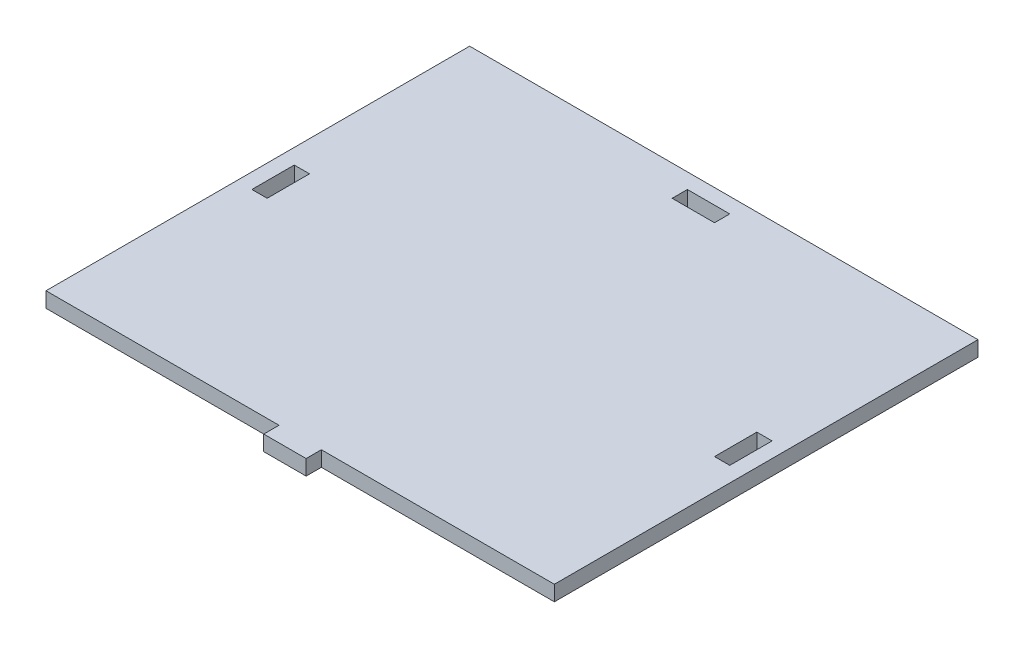
ISO-10303-21;
HEADER;
FILE_DESCRIPTION(('STEP AP214'),'2;1');
FILE_NAME('part.step','',(''),(''),'','','');
FILE_SCHEMA(('AUTOMOTIVE_DESIGN { 1 0 10303 214 1 1 1 1 }'));
ENDSEC;
DATA;
#1=APPLICATION_CONTEXT('core data for automotive mechanical design processes');
#2=APPLICATION_PROTOCOL_DEFINITION('international standard','automotive_design',2000,#1);
#3=PRODUCT_CONTEXT('',#1,'mechanical');
#4=PRODUCT('Part','Part','',(#3));
#5=PRODUCT_RELATED_PRODUCT_CATEGORY('part','',(#4));
#6=PRODUCT_DEFINITION_FORMATION('','',#4);
#7=PRODUCT_DEFINITION_CONTEXT('part definition',#1,'design');
#8=PRODUCT_DEFINITION('design','',#6,#7);
#9=PRODUCT_DEFINITION_SHAPE('','',#8);
#10=(LENGTH_UNIT() NAMED_UNIT(*) SI_UNIT(.MILLI.,.METRE.));
#11=(NAMED_UNIT(*) PLANE_ANGLE_UNIT() SI_UNIT($,.RADIAN.));
#12=(NAMED_UNIT(*) SI_UNIT($,.STERADIAN.) SOLID_ANGLE_UNIT());
#13=UNCERTAINTY_MEASURE_WITH_UNIT(LENGTH_MEASURE(1.E-05),#10,'distance_accuracy_value','');
#14=(GEOMETRIC_REPRESENTATION_CONTEXT(3) GLOBAL_UNCERTAINTY_ASSIGNED_CONTEXT((#13)) GLOBAL_UNIT_ASSIGNED_CONTEXT((#10,
#11,#12)) REPRESENTATION_CONTEXT('',''));
#15=CARTESIAN_POINT('',(0.,0.,0.));
#16=DIRECTION('',(0.,0.,1.));
#17=DIRECTION('',(1.,0.,0.));
#18=AXIS2_PLACEMENT_3D('',#15,#16,#17);
#19=CARTESIAN_POINT('',(0.,18.,0.));
#20=DIRECTION('',(0.,-1.,0.));
#21=DIRECTION('',(0.,0.,-1.));
#22=AXIS2_PLACEMENT_3D('',#19,#20,#21);
#23=PLANE('',#22);
#24=DIRECTION('',(0.,0.,-1.));
#25=VECTOR('',#24,1.);
#26=CARTESIAN_POINT('',(282.,18.,-25.));
#27=LINE('',#26,#25);
#28=CARTESIAN_POINT('',(282.,18.,25.));
#29=VERTEX_POINT('',#28);
#30=CARTESIAN_POINT('',(282.,18.,-25.));
#31=VERTEX_POINT('',#30);
#32=EDGE_CURVE('E206',#29,#31,#27,.T.);
#33=ORIENTED_EDGE('',*,*,#32,.F.);
#34=DIRECTION('',(1.,0.,0.));
#35=VECTOR('',#34,1.);
#36=CARTESIAN_POINT('',(264.,18.,25.));
#37=LINE('',#36,#35);
#38=CARTESIAN_POINT('',(264.,18.,25.));
#39=VERTEX_POINT('',#38);
#40=EDGE_CURVE('E214',#39,#29,#37,.T.);
#41=ORIENTED_EDGE('',*,*,#40,.F.);
#42=DIRECTION('',(0.,0.,1.));
#43=VECTOR('',#42,1.);
#44=CARTESIAN_POINT('',(264.,18.,-25.));
#45=LINE('',#44,#43);
#46=CARTESIAN_POINT('',(264.,18.,-25.));
#47=VERTEX_POINT('',#46);
#48=EDGE_CURVE('E211',#47,#39,#45,.T.);
#49=ORIENTED_EDGE('',*,*,#48,.F.);
#50=DIRECTION('',(-1.,0.,0.));
#51=VECTOR('',#50,1.);
#52=CARTESIAN_POINT('',(264.,18.,-25.));
#53=LINE('',#52,#51);
#54=EDGE_CURVE('E208',#31,#47,#53,.T.);
#55=ORIENTED_EDGE('',*,*,#54,.F.);
#56=EDGE_LOOP('',(#33,#41,#49,#55));
#57=FACE_BOUND('',#56,.T.);
#58=DIRECTION('',(1.,0.,0.));
#59=VECTOR('',#58,1.);
#60=CARTESIAN_POINT('',(24.9999999999999,18.,250.));
#61=LINE('',#60,#59);
#62=CARTESIAN_POINT('',(24.9999999999999,18.,250.));
#63=VERTEX_POINT('',#62);
#64=CARTESIAN_POINT('',(300.,18.,250.));
#65=VERTEX_POINT('',#64);
#66=EDGE_CURVE('E268',#63,#65,#61,.T.);
#67=ORIENTED_EDGE('',*,*,#66,.T.);
#68=DIRECTION('',(0.,0.,-1.));
#69=VECTOR('',#68,1.);
#70=CARTESIAN_POINT('',(300.,18.,-250.));
#71=LINE('',#70,#69);
#72=CARTESIAN_POINT('',(300.,18.,-250.));
#73=VERTEX_POINT('',#72);
#74=EDGE_CURVE('E271',#65,#73,#71,.T.);
#75=ORIENTED_EDGE('',*,*,#74,.T.);
#76=DIRECTION('',(-1.,0.,0.));
#77=VECTOR('',#76,1.);
#78=CARTESIAN_POINT('',(-300.,18.,-250.));
#79=LINE('',#78,#77);
#80=CARTESIAN_POINT('',(-300.,18.,-250.));
#81=VERTEX_POINT('',#80);
#82=EDGE_CURVE('E274',#73,#81,#79,.T.);
#83=ORIENTED_EDGE('',*,*,#82,.T.);
#84=DIRECTION('',(0.,0.,1.));
#85=VECTOR('',#84,1.);
#86=CARTESIAN_POINT('',(-300.,18.,-250.));
#87=LINE('',#86,#85);
#88=CARTESIAN_POINT('',(-300.,18.,250.));
#89=VERTEX_POINT('',#88);
#90=EDGE_CURVE('E276',#81,#89,#87,.T.);
#91=ORIENTED_EDGE('',*,*,#90,.T.);
#92=DIRECTION('',(1.,0.,0.));
#93=VECTOR('',#92,1.);
#94=CARTESIAN_POINT('',(-300.,18.,250.));
#95=LINE('',#94,#93);
#96=CARTESIAN_POINT('',(-25.0000000000001,18.,250.));
#97=VERTEX_POINT('',#96);
#98=EDGE_CURVE('E278',#89,#97,#95,.T.);
#99=ORIENTED_EDGE('',*,*,#98,.T.);
#100=DIRECTION('',(0.,0.,1.));
#101=VECTOR('',#100,1.);
#102=CARTESIAN_POINT('',(-25.0000000000001,18.,250.));
#103=LINE('',#102,#101);
#104=CARTESIAN_POINT('',(-25.0000000000001,18.,268.));
#105=VERTEX_POINT('',#104);
#106=EDGE_CURVE('E280',#97,#105,#103,.T.);
#107=ORIENTED_EDGE('',*,*,#106,.T.);
#108=DIRECTION('',(1.,0.,0.));
#109=VECTOR('',#108,1.);
#110=CARTESIAN_POINT('',(-25.0000000000001,18.,268.));
#111=LINE('',#110,#109);
#112=CARTESIAN_POINT('',(24.9999999999999,18.,268.));
#113=VERTEX_POINT('',#112);
#114=EDGE_CURVE('E282',#105,#113,#111,.T.);
#115=ORIENTED_EDGE('',*,*,#114,.T.);
#116=DIRECTION('',(0.,0.,-1.));
#117=VECTOR('',#116,1.);
#118=CARTESIAN_POINT('',(24.9999999999999,18.,250.));
#119=LINE('',#118,#117);
#120=EDGE_CURVE('E284',#113,#63,#119,.T.);
#121=ORIENTED_EDGE('',*,*,#120,.T.);
#122=EDGE_LOOP('',(#67,#75,#83,#91,#99,#107,#115,#121));
#123=FACE_BOUND('',#122,.T.);
#124=DIRECTION('',(0.,0.,-1.));
#125=VECTOR('',#124,1.);
#126=CARTESIAN_POINT('',(25.,18.,-232.));
#127=LINE('',#126,#125);
#128=CARTESIAN_POINT('',(25.,18.,-214.));
#129=VERTEX_POINT('',#128);
#130=CARTESIAN_POINT('',(25.,18.,-232.));
#131=VERTEX_POINT('',#130);
#132=EDGE_CURVE('E237',#129,#131,#127,.T.);
#133=ORIENTED_EDGE('',*,*,#132,.F.);
#134=DIRECTION('',(1.,0.,0.));
#135=VECTOR('',#134,1.);
#136=CARTESIAN_POINT('',(-25.,18.,-214.));
#137=LINE('',#136,#135);
#138=CARTESIAN_POINT('',(-25.,18.,-214.));
#139=VERTEX_POINT('',#138);
#140=EDGE_CURVE('E245',#139,#129,#137,.T.);
#141=ORIENTED_EDGE('',*,*,#140,.F.);
#142=DIRECTION('',(0.,0.,1.));
#143=VECTOR('',#142,1.);
#144=CARTESIAN_POINT('',(-25.,18.,-232.));
#145=LINE('',#144,#143);
#146=CARTESIAN_POINT('',(-25.,18.,-232.));
#147=VERTEX_POINT('',#146);
#148=EDGE_CURVE('E242',#147,#139,#145,.T.);
#149=ORIENTED_EDGE('',*,*,#148,.F.);
#150=DIRECTION('',(-1.,0.,0.));
#151=VECTOR('',#150,1.);
#152=CARTESIAN_POINT('',(-25.,18.,-232.));
#153=LINE('',#152,#151);
#154=EDGE_CURVE('E239',#131,#147,#153,.T.);
#155=ORIENTED_EDGE('',*,*,#154,.F.);
#156=EDGE_LOOP('',(#133,#141,#149,#155));
#157=FACE_BOUND('',#156,.T.);
#158=DIRECTION('',(0.,0.,-1.));
#159=VECTOR('',#158,1.);
#160=CARTESIAN_POINT('',(-264.,18.,-25.));
#161=LINE('',#160,#159);
#162=CARTESIAN_POINT('',(-264.,18.,25.));
#163=VERTEX_POINT('',#162);
#164=CARTESIAN_POINT('',(-264.,18.,-25.));
#165=VERTEX_POINT('',#164);
#166=EDGE_CURVE('E170',#163,#165,#161,.T.);
#167=ORIENTED_EDGE('',*,*,#166,.F.);
#168=DIRECTION('',(1.,0.,0.));
#169=VECTOR('',#168,1.);
#170=CARTESIAN_POINT('',(-264.,18.,25.));
#171=LINE('',#170,#169);
#172=CARTESIAN_POINT('',(-282.,18.,25.));
#173=VERTEX_POINT('',#172);
#174=EDGE_CURVE('E192',#173,#163,#171,.T.);
#175=ORIENTED_EDGE('',*,*,#174,.F.);
#176=DIRECTION('',(0.,0.,1.));
#177=VECTOR('',#176,1.);
#178=CARTESIAN_POINT('',(-282.,18.,-25.));
#179=LINE('',#178,#177);
#180=CARTESIAN_POINT('',(-282.,18.,-25.));
#181=VERTEX_POINT('',#180);
#182=EDGE_CURVE('E190',#181,#173,#179,.T.);
#183=ORIENTED_EDGE('',*,*,#182,.F.);
#184=DIRECTION('',(-1.,0.,0.));
#185=VECTOR('',#184,1.);
#186=CARTESIAN_POINT('',(-264.,18.,-25.));
#187=LINE('',#186,#185);
#188=EDGE_CURVE('E178',#165,#181,#187,.T.);
#189=ORIENTED_EDGE('',*,*,#188,.F.);
#190=EDGE_LOOP('',(#167,#175,#183,#189));
#191=FACE_BOUND('',#190,.T.);
#192=ADVANCED_FACE('F33',(#57,#123,#157,#191),#23,.F.);
#193=CARTESIAN_POINT('',(0.,0.,0.));
#194=DIRECTION('',(0.,-1.,0.));
#195=DIRECTION('',(0.,0.,-1.));
#196=AXIS2_PLACEMENT_3D('',#193,#194,#195);
#197=PLANE('',#196);
#198=DIRECTION('',(1.,0.,0.));
#199=VECTOR('',#198,1.);
#200=CARTESIAN_POINT('',(24.9999999999999,0.,250.));
#201=LINE('',#200,#199);
#202=CARTESIAN_POINT('',(24.9999999999999,0.,250.));
#203=VERTEX_POINT('',#202);
#204=CARTESIAN_POINT('',(300.,0.,250.));
#205=VERTEX_POINT('',#204);
#206=EDGE_CURVE('E267',#203,#205,#201,.T.);
#207=ORIENTED_EDGE('',*,*,#206,.F.);
#208=DIRECTION('',(0.,0.,-1.));
#209=VECTOR('',#208,1.);
#210=CARTESIAN_POINT('',(24.9999999999999,0.,250.));
#211=LINE('',#210,#209);
#212=CARTESIAN_POINT('',(24.9999999999999,0.,268.));
#213=VERTEX_POINT('',#212);
#214=EDGE_CURVE('E272',#213,#203,#211,.T.);
#215=ORIENTED_EDGE('',*,*,#214,.F.);
#216=DIRECTION('',(1.,0.,0.));
#217=VECTOR('',#216,1.);
#218=CARTESIAN_POINT('',(-25.0000000000001,0.,268.));
#219=LINE('',#218,#217);
#220=CARTESIAN_POINT('',(-25.0000000000001,0.,268.));
#221=VERTEX_POINT('',#220);
#222=EDGE_CURVE('E299',#221,#213,#219,.T.);
#223=ORIENTED_EDGE('',*,*,#222,.F.);
#224=DIRECTION('',(0.,0.,1.));
#225=VECTOR('',#224,1.);
#226=CARTESIAN_POINT('',(-25.0000000000001,0.,250.));
#227=LINE('',#226,#225);
#228=CARTESIAN_POINT('',(-25.0000000000001,0.,250.));
#229=VERTEX_POINT('',#228);
#230=EDGE_CURVE('E297',#229,#221,#227,.T.);
#231=ORIENTED_EDGE('',*,*,#230,.F.);
#232=DIRECTION('',(1.,0.,0.));
#233=VECTOR('',#232,1.);
#234=CARTESIAN_POINT('',(-300.,0.,250.));
#235=LINE('',#234,#233);
#236=CARTESIAN_POINT('',(-300.,0.,250.));
#237=VERTEX_POINT('',#236);
#238=EDGE_CURVE('E295',#237,#229,#235,.T.);
#239=ORIENTED_EDGE('',*,*,#238,.F.);
#240=DIRECTION('',(0.,0.,1.));
#241=VECTOR('',#240,1.);
#242=CARTESIAN_POINT('',(-300.,0.,-250.));
#243=LINE('',#242,#241);
#244=CARTESIAN_POINT('',(-300.,0.,-250.));
#245=VERTEX_POINT('',#244);
#246=EDGE_CURVE('E293',#245,#237,#243,.T.);
#247=ORIENTED_EDGE('',*,*,#246,.F.);
#248=DIRECTION('',(-1.,0.,0.));
#249=VECTOR('',#248,1.);
#250=CARTESIAN_POINT('',(-300.,0.,-250.));
#251=LINE('',#250,#249);
#252=CARTESIAN_POINT('',(300.,0.,-250.));
#253=VERTEX_POINT('',#252);
#254=EDGE_CURVE('E291',#253,#245,#251,.T.);
#255=ORIENTED_EDGE('',*,*,#254,.F.);
#256=DIRECTION('',(0.,0.,-1.));
#257=VECTOR('',#256,1.);
#258=CARTESIAN_POINT('',(300.,0.,-250.));
#259=LINE('',#258,#257);
#260=EDGE_CURVE('E289',#205,#253,#259,.T.);
#261=ORIENTED_EDGE('',*,*,#260,.F.);
#262=EDGE_LOOP('',(#207,#215,#223,#231,#239,#247,#255,#261));
#263=FACE_BOUND('',#262,.T.);
#264=DIRECTION('',(1.,0.,0.));
#265=VECTOR('',#264,1.);
#266=CARTESIAN_POINT('',(-25.,0.,-214.));
#267=LINE('',#266,#265);
#268=CARTESIAN_POINT('',(-25.,0.,-214.));
#269=VERTEX_POINT('',#268);
#270=CARTESIAN_POINT('',(25.,0.,-214.));
#271=VERTEX_POINT('',#270);
#272=EDGE_CURVE('E240',#269,#271,#267,.T.);
#273=ORIENTED_EDGE('',*,*,#272,.T.);
#274=DIRECTION('',(0.,0.,-1.));
#275=VECTOR('',#274,1.);
#276=CARTESIAN_POINT('',(25.,0.,-232.));
#277=LINE('',#276,#275);
#278=CARTESIAN_POINT('',(25.,0.,-232.));
#279=VERTEX_POINT('',#278);
#280=EDGE_CURVE('E236',#271,#279,#277,.T.);
#281=ORIENTED_EDGE('',*,*,#280,.T.);
#282=DIRECTION('',(-1.,0.,0.));
#283=VECTOR('',#282,1.);
#284=CARTESIAN_POINT('',(-25.,0.,-232.));
#285=LINE('',#284,#283);
#286=CARTESIAN_POINT('',(-25.,0.,-232.));
#287=VERTEX_POINT('',#286);
#288=EDGE_CURVE('E250',#279,#287,#285,.T.);
#289=ORIENTED_EDGE('',*,*,#288,.T.);
#290=DIRECTION('',(0.,0.,1.));
#291=VECTOR('',#290,1.);
#292=CARTESIAN_POINT('',(-25.,0.,-232.));
#293=LINE('',#292,#291);
#294=EDGE_CURVE('E253',#287,#269,#293,.T.);
#295=ORIENTED_EDGE('',*,*,#294,.T.);
#296=EDGE_LOOP('',(#273,#281,#289,#295));
#297=FACE_BOUND('',#296,.T.);
#298=DIRECTION('',(1.,0.,0.));
#299=VECTOR('',#298,1.);
#300=CARTESIAN_POINT('',(264.,0.,25.));
#301=LINE('',#300,#299);
#302=CARTESIAN_POINT('',(264.,0.,25.));
#303=VERTEX_POINT('',#302);
#304=CARTESIAN_POINT('',(282.,0.,25.));
#305=VERTEX_POINT('',#304);
#306=EDGE_CURVE('E209',#303,#305,#301,.T.);
#307=ORIENTED_EDGE('',*,*,#306,.T.);
#308=DIRECTION('',(0.,0.,-1.));
#309=VECTOR('',#308,1.);
#310=CARTESIAN_POINT('',(282.,0.,-25.));
#311=LINE('',#310,#309);
#312=CARTESIAN_POINT('',(282.,0.,-25.));
#313=VERTEX_POINT('',#312);
#314=EDGE_CURVE('E186',#305,#313,#311,.T.);
#315=ORIENTED_EDGE('',*,*,#314,.T.);
#316=DIRECTION('',(-1.,0.,0.));
#317=VECTOR('',#316,1.);
#318=CARTESIAN_POINT('',(264.,0.,-25.));
#319=LINE('',#318,#317);
#320=CARTESIAN_POINT('',(264.,0.,-25.));
#321=VERTEX_POINT('',#320);
#322=EDGE_CURVE('E219',#313,#321,#319,.T.);
#323=ORIENTED_EDGE('',*,*,#322,.T.);
#324=DIRECTION('',(0.,0.,1.));
#325=VECTOR('',#324,1.);
#326=CARTESIAN_POINT('',(264.,0.,-25.));
#327=LINE('',#326,#325);
#328=EDGE_CURVE('E222',#321,#303,#327,.T.);
#329=ORIENTED_EDGE('',*,*,#328,.T.);
#330=EDGE_LOOP('',(#307,#315,#323,#329));
#331=FACE_BOUND('',#330,.T.);
#332=DIRECTION('',(1.,0.,0.));
#333=VECTOR('',#332,1.);
#334=CARTESIAN_POINT('',(-264.,0.,25.));
#335=LINE('',#334,#333);
#336=CARTESIAN_POINT('',(-282.,0.,25.));
#337=VERTEX_POINT('',#336);
#338=CARTESIAN_POINT('',(-264.,0.,25.));
#339=VERTEX_POINT('',#338);
#340=EDGE_CURVE('E179',#337,#339,#335,.T.);
#341=ORIENTED_EDGE('',*,*,#340,.T.);
#342=DIRECTION('',(0.,0.,-1.));
#343=VECTOR('',#342,1.);
#344=CARTESIAN_POINT('',(-264.,0.,-25.));
#345=LINE('',#344,#343);
#346=CARTESIAN_POINT('',(-264.,0.,-25.));
#347=VERTEX_POINT('',#346);
#348=EDGE_CURVE('E56',#339,#347,#345,.T.);
#349=ORIENTED_EDGE('',*,*,#348,.T.);
#350=DIRECTION('',(-1.,0.,0.));
#351=VECTOR('',#350,1.);
#352=CARTESIAN_POINT('',(-264.,0.,-25.));
#353=LINE('',#352,#351);
#354=CARTESIAN_POINT('',(-282.,0.,-25.));
#355=VERTEX_POINT('',#354);
#356=EDGE_CURVE('E185',#347,#355,#353,.T.);
#357=ORIENTED_EDGE('',*,*,#356,.T.);
#358=DIRECTION('',(0.,0.,1.));
#359=VECTOR('',#358,1.);
#360=CARTESIAN_POINT('',(-282.,0.,-25.));
#361=LINE('',#360,#359);
#362=EDGE_CURVE('E198',#355,#337,#361,.T.);
#363=ORIENTED_EDGE('',*,*,#362,.T.);
#364=EDGE_LOOP('',(#341,#349,#357,#363));
#365=FACE_BOUND('',#364,.T.);
#366=ADVANCED_FACE('F329',(#263,#297,#331,#365),#197,.T.);
#367=CARTESIAN_POINT('',(24.9999999999999,18.,250.));
#368=DIRECTION('',(0.,0.,-1.));
#369=DIRECTION('',(-1.,0.,0.));
#370=AXIS2_PLACEMENT_3D('',#367,#368,#369);
#371=PLANE('',#370);
#372=ORIENTED_EDGE('',*,*,#206,.T.);
#373=DIRECTION('',(0.,-1.,0.));
#374=VECTOR('',#373,1.);
#375=CARTESIAN_POINT('',(300.,18.,250.));
#376=LINE('',#375,#374);
#377=EDGE_CURVE('E11',#65,#205,#376,.T.);
#378=ORIENTED_EDGE('',*,*,#377,.F.);
#379=ORIENTED_EDGE('',*,*,#66,.F.);
#380=DIRECTION('',(0.,-1.,0.));
#381=VECTOR('',#380,1.);
#382=CARTESIAN_POINT('',(24.9999999999999,18.,250.));
#383=LINE('',#382,#381);
#384=EDGE_CURVE('E286',#63,#203,#383,.T.);
#385=ORIENTED_EDGE('',*,*,#384,.T.);
#386=EDGE_LOOP('',(#372,#378,#379,#385));
#387=FACE_BOUND('',#386,.T.);
#388=ADVANCED_FACE('F35',(#387),#371,.F.);
#389=CARTESIAN_POINT('',(300.,18.,-250.));
#390=DIRECTION('',(-1.,0.,0.));
#391=DIRECTION('',(0.,0.,1.));
#392=AXIS2_PLACEMENT_3D('',#389,#390,#391);
#393=PLANE('',#392);
#394=ORIENTED_EDGE('',*,*,#260,.T.);
#395=DIRECTION('',(0.,-1.,0.));
#396=VECTOR('',#395,1.);
#397=CARTESIAN_POINT('',(300.,18.,-250.));
#398=LINE('',#397,#396);
#399=EDGE_CURVE('E41',#73,#253,#398,.T.);
#400=ORIENTED_EDGE('',*,*,#399,.F.);
#401=ORIENTED_EDGE('',*,*,#74,.F.);
#402=ORIENTED_EDGE('',*,*,#377,.T.);
#403=EDGE_LOOP('',(#394,#400,#401,#402));
#404=FACE_BOUND('',#403,.T.);
#405=ADVANCED_FACE('F347',(#404),#393,.F.);
#406=CARTESIAN_POINT('',(-300.,18.,-250.));
#407=DIRECTION('',(0.,0.,1.));
#408=DIRECTION('',(1.,0.,0.));
#409=AXIS2_PLACEMENT_3D('',#406,#407,#408);
#410=PLANE('',#409);
#411=ORIENTED_EDGE('',*,*,#254,.T.);
#412=DIRECTION('',(0.,-1.,0.));
#413=VECTOR('',#412,1.);
#414=CARTESIAN_POINT('',(-300.,18.,-250.));
#415=LINE('',#414,#413);
#416=EDGE_CURVE('E316',#81,#245,#415,.T.);
#417=ORIENTED_EDGE('',*,*,#416,.F.);
#418=ORIENTED_EDGE('',*,*,#82,.F.);
#419=ORIENTED_EDGE('',*,*,#399,.T.);
#420=EDGE_LOOP('',(#411,#417,#418,#419));
#421=FACE_BOUND('',#420,.T.);
#422=ADVANCED_FACE('F323',(#421),#410,.F.);
#423=CARTESIAN_POINT('',(-300.,18.,-250.));
#424=DIRECTION('',(1.,0.,0.));
#425=DIRECTION('',(0.,0.,-1.));
#426=AXIS2_PLACEMENT_3D('',#423,#424,#425);
#427=PLANE('',#426);
#428=ORIENTED_EDGE('',*,*,#246,.T.);
#429=DIRECTION('',(0.,-1.,0.));
#430=VECTOR('',#429,1.);
#431=CARTESIAN_POINT('',(-300.,18.,250.));
#432=LINE('',#431,#430);
#433=EDGE_CURVE('E313',#89,#237,#432,.T.);
#434=ORIENTED_EDGE('',*,*,#433,.F.);
#435=ORIENTED_EDGE('',*,*,#90,.F.);
#436=ORIENTED_EDGE('',*,*,#416,.T.);
#437=EDGE_LOOP('',(#428,#434,#435,#436));
#438=FACE_BOUND('',#437,.T.);
#439=ADVANCED_FACE('F335',(#438),#427,.F.);
#440=CARTESIAN_POINT('',(-300.,18.,250.));
#441=DIRECTION('',(0.,0.,-1.));
#442=DIRECTION('',(-1.,0.,0.));
#443=AXIS2_PLACEMENT_3D('',#440,#441,#442);
#444=PLANE('',#443);
#445=ORIENTED_EDGE('',*,*,#238,.T.);
#446=DIRECTION('',(0.,-1.,0.));
#447=VECTOR('',#446,1.);
#448=CARTESIAN_POINT('',(-25.0000000000001,18.,250.));
#449=LINE('',#448,#447);
#450=EDGE_CURVE('E310',#97,#229,#449,.T.);
#451=ORIENTED_EDGE('',*,*,#450,.F.);
#452=ORIENTED_EDGE('',*,*,#98,.F.);
#453=ORIENTED_EDGE('',*,*,#433,.T.);
#454=EDGE_LOOP('',(#445,#451,#452,#453));
#455=FACE_BOUND('',#454,.T.);
#456=ADVANCED_FACE('F339',(#455),#444,.F.);
#457=CARTESIAN_POINT('',(-25.0000000000001,18.,250.));
#458=DIRECTION('',(1.,0.,0.));
#459=DIRECTION('',(0.,0.,-1.));
#460=AXIS2_PLACEMENT_3D('',#457,#458,#459);
#461=PLANE('',#460);
#462=ORIENTED_EDGE('',*,*,#230,.T.);
#463=DIRECTION('',(0.,-1.,0.));
#464=VECTOR('',#463,1.);
#465=CARTESIAN_POINT('',(-25.0000000000001,18.,268.));
#466=LINE('',#465,#464);
#467=EDGE_CURVE('E307',#105,#221,#466,.T.);
#468=ORIENTED_EDGE('',*,*,#467,.F.);
#469=ORIENTED_EDGE('',*,*,#106,.F.);
#470=ORIENTED_EDGE('',*,*,#450,.T.);
#471=EDGE_LOOP('',(#462,#468,#469,#470));
#472=FACE_BOUND('',#471,.T.);
#473=ADVANCED_FACE('F360',(#472),#461,.F.);
#474=CARTESIAN_POINT('',(-25.0000000000001,18.,268.));
#475=DIRECTION('',(0.,0.,-1.));
#476=DIRECTION('',(-1.,0.,0.));
#477=AXIS2_PLACEMENT_3D('',#474,#475,#476);
#478=PLANE('',#477);
#479=ORIENTED_EDGE('',*,*,#222,.T.);
#480=DIRECTION('',(0.,-1.,0.));
#481=VECTOR('',#480,1.);
#482=CARTESIAN_POINT('',(24.9999999999999,18.,268.));
#483=LINE('',#482,#481);
#484=EDGE_CURVE('E304',#113,#213,#483,.T.);
#485=ORIENTED_EDGE('',*,*,#484,.F.);
#486=ORIENTED_EDGE('',*,*,#114,.F.);
#487=ORIENTED_EDGE('',*,*,#467,.T.);
#488=EDGE_LOOP('',(#479,#485,#486,#487));
#489=FACE_BOUND('',#488,.T.);
#490=ADVANCED_FACE('F358',(#489),#478,.F.);
#491=CARTESIAN_POINT('',(24.9999999999999,18.,250.));
#492=DIRECTION('',(-1.,0.,0.));
#493=DIRECTION('',(0.,0.,1.));
#494=AXIS2_PLACEMENT_3D('',#491,#492,#493);
#495=PLANE('',#494);
#496=ORIENTED_EDGE('',*,*,#214,.T.);
#497=ORIENTED_EDGE('',*,*,#384,.F.);
#498=ORIENTED_EDGE('',*,*,#120,.F.);
#499=ORIENTED_EDGE('',*,*,#484,.T.);
#500=EDGE_LOOP('',(#496,#497,#498,#499));
#501=FACE_BOUND('',#500,.T.);
#502=ADVANCED_FACE('F353',(#501),#495,.F.);
#503=CARTESIAN_POINT('',(25.,18.,-232.));
#504=DIRECTION('',(-1.,0.,0.));
#505=DIRECTION('',(0.,0.,1.));
#506=AXIS2_PLACEMENT_3D('',#503,#504,#505);
#507=PLANE('',#506);
#508=ORIENTED_EDGE('',*,*,#280,.F.);
#509=DIRECTION('',(0.,-1.,0.));
#510=VECTOR('',#509,1.);
#511=CARTESIAN_POINT('',(25.,18.,-214.));
#512=LINE('',#511,#510);
#513=EDGE_CURVE('E247',#129,#271,#512,.T.);
#514=ORIENTED_EDGE('',*,*,#513,.F.);
#515=ORIENTED_EDGE('',*,*,#132,.T.);
#516=DIRECTION('',(0.,-1.,0.));
#517=VECTOR('',#516,1.);
#518=CARTESIAN_POINT('',(25.,18.,-232.));
#519=LINE('',#518,#517);
#520=EDGE_CURVE('E264',#131,#279,#519,.T.);
#521=ORIENTED_EDGE('',*,*,#520,.T.);
#522=EDGE_LOOP('',(#508,#514,#515,#521));
#523=FACE_BOUND('',#522,.T.);
#524=ADVANCED_FACE('F378',(#523),#507,.T.);
#525=CARTESIAN_POINT('',(-25.,18.,-232.));
#526=DIRECTION('',(0.,0.,1.));
#527=DIRECTION('',(1.,0.,0.));
#528=AXIS2_PLACEMENT_3D('',#525,#526,#527);
#529=PLANE('',#528);
#530=ORIENTED_EDGE('',*,*,#288,.F.);
#531=ORIENTED_EDGE('',*,*,#520,.F.);
#532=ORIENTED_EDGE('',*,*,#154,.T.);
#533=DIRECTION('',(0.,-1.,0.));
#534=VECTOR('',#533,1.);
#535=CARTESIAN_POINT('',(-25.,18.,-232.));
#536=LINE('',#535,#534);
#537=EDGE_CURVE('E262',#147,#287,#536,.T.);
#538=ORIENTED_EDGE('',*,*,#537,.T.);
#539=EDGE_LOOP('',(#530,#531,#532,#538));
#540=FACE_BOUND('',#539,.T.);
#541=ADVANCED_FACE('F385',(#540),#529,.T.);
#542=CARTESIAN_POINT('',(-25.,18.,-232.));
#543=DIRECTION('',(1.,0.,0.));
#544=DIRECTION('',(0.,0.,-1.));
#545=AXIS2_PLACEMENT_3D('',#542,#543,#544);
#546=PLANE('',#545);
#547=ORIENTED_EDGE('',*,*,#294,.F.);
#548=ORIENTED_EDGE('',*,*,#537,.F.);
#549=ORIENTED_EDGE('',*,*,#148,.T.);
#550=DIRECTION('',(0.,-1.,0.));
#551=VECTOR('',#550,1.);
#552=CARTESIAN_POINT('',(-25.,18.,-214.));
#553=LINE('',#552,#551);
#554=EDGE_CURVE('E260',#139,#269,#553,.T.);
#555=ORIENTED_EDGE('',*,*,#554,.T.);
#556=EDGE_LOOP('',(#547,#548,#549,#555));
#557=FACE_BOUND('',#556,.T.);
#558=ADVANCED_FACE('F390',(#557),#546,.T.);
#559=CARTESIAN_POINT('',(-25.,18.,-214.));
#560=DIRECTION('',(0.,0.,-1.));
#561=DIRECTION('',(-1.,0.,0.));
#562=AXIS2_PLACEMENT_3D('',#559,#560,#561);
#563=PLANE('',#562);
#564=ORIENTED_EDGE('',*,*,#272,.F.);
#565=ORIENTED_EDGE('',*,*,#554,.F.);
#566=ORIENTED_EDGE('',*,*,#140,.T.);
#567=ORIENTED_EDGE('',*,*,#513,.T.);
#568=EDGE_LOOP('',(#564,#565,#566,#567));
#569=FACE_BOUND('',#568,.T.);
#570=ADVANCED_FACE('F397',(#569),#563,.T.);
#571=CARTESIAN_POINT('',(282.,18.,-25.));
#572=DIRECTION('',(-1.,0.,0.));
#573=DIRECTION('',(0.,0.,1.));
#574=AXIS2_PLACEMENT_3D('',#571,#572,#573);
#575=PLANE('',#574);
#576=ORIENTED_EDGE('',*,*,#314,.F.);
#577=DIRECTION('',(0.,-1.,0.));
#578=VECTOR('',#577,1.);
#579=CARTESIAN_POINT('',(282.,18.,25.));
#580=LINE('',#579,#578);
#581=EDGE_CURVE('E216',#29,#305,#580,.T.);
#582=ORIENTED_EDGE('',*,*,#581,.F.);
#583=ORIENTED_EDGE('',*,*,#32,.T.);
#584=DIRECTION('',(0.,-1.,0.));
#585=VECTOR('',#584,1.);
#586=CARTESIAN_POINT('',(282.,18.,-25.));
#587=LINE('',#586,#585);
#588=EDGE_CURVE('E233',#31,#313,#587,.T.);
#589=ORIENTED_EDGE('',*,*,#588,.T.);
#590=EDGE_LOOP('',(#576,#582,#583,#589));
#591=FACE_BOUND('',#590,.T.);
#592=ADVANCED_FACE('F410',(#591),#575,.T.);
#593=CARTESIAN_POINT('',(264.,18.,-25.));
#594=DIRECTION('',(0.,0.,1.));
#595=DIRECTION('',(1.,0.,0.));
#596=AXIS2_PLACEMENT_3D('',#593,#594,#595);
#597=PLANE('',#596);
#598=ORIENTED_EDGE('',*,*,#322,.F.);
#599=ORIENTED_EDGE('',*,*,#588,.F.);
#600=ORIENTED_EDGE('',*,*,#54,.T.);
#601=DIRECTION('',(0.,-1.,0.));
#602=VECTOR('',#601,1.);
#603=CARTESIAN_POINT('',(264.,18.,-25.));
#604=LINE('',#603,#602);
#605=EDGE_CURVE('E231',#47,#321,#604,.T.);
#606=ORIENTED_EDGE('',*,*,#605,.T.);
#607=EDGE_LOOP('',(#598,#599,#600,#606));
#608=FACE_BOUND('',#607,.T.);
#609=ADVANCED_FACE('F415',(#608),#597,.T.);
#610=CARTESIAN_POINT('',(264.,18.,-25.));
#611=DIRECTION('',(1.,0.,0.));
#612=DIRECTION('',(0.,0.,-1.));
#613=AXIS2_PLACEMENT_3D('',#610,#611,#612);
#614=PLANE('',#613);
#615=ORIENTED_EDGE('',*,*,#328,.F.);
#616=ORIENTED_EDGE('',*,*,#605,.F.);
#617=ORIENTED_EDGE('',*,*,#48,.T.);
#618=DIRECTION('',(0.,-1.,0.));
#619=VECTOR('',#618,1.);
#620=CARTESIAN_POINT('',(264.,18.,25.));
#621=LINE('',#620,#619);
#622=EDGE_CURVE('E229',#39,#303,#621,.T.);
#623=ORIENTED_EDGE('',*,*,#622,.T.);
#624=EDGE_LOOP('',(#615,#616,#617,#623));
#625=FACE_BOUND('',#624,.T.);
#626=ADVANCED_FACE('F419',(#625),#614,.T.);
#627=CARTESIAN_POINT('',(264.,18.,25.));
#628=DIRECTION('',(0.,0.,-1.));
#629=DIRECTION('',(-1.,0.,0.));
#630=AXIS2_PLACEMENT_3D('',#627,#628,#629);
#631=PLANE('',#630);
#632=ORIENTED_EDGE('',*,*,#306,.F.);
#633=ORIENTED_EDGE('',*,*,#622,.F.);
#634=ORIENTED_EDGE('',*,*,#40,.T.);
#635=ORIENTED_EDGE('',*,*,#581,.T.);
#636=EDGE_LOOP('',(#632,#633,#634,#635));
#637=FACE_BOUND('',#636,.T.);
#638=ADVANCED_FACE('F423',(#637),#631,.T.);
#639=CARTESIAN_POINT('',(-264.,18.,-25.));
#640=DIRECTION('',(-1.,0.,0.));
#641=DIRECTION('',(0.,0.,1.));
#642=AXIS2_PLACEMENT_3D('',#639,#640,#641);
#643=PLANE('',#642);
#644=ORIENTED_EDGE('',*,*,#348,.F.);
#645=DIRECTION('',(0.,-1.,0.));
#646=VECTOR('',#645,1.);
#647=CARTESIAN_POINT('',(-264.,18.,25.));
#648=LINE('',#647,#646);
#649=EDGE_CURVE('E174',#163,#339,#648,.T.);
#650=ORIENTED_EDGE('',*,*,#649,.F.);
#651=ORIENTED_EDGE('',*,*,#166,.T.);
#652=DIRECTION('',(0.,-1.,0.));
#653=VECTOR('',#652,1.);
#654=CARTESIAN_POINT('',(-264.,18.,-25.));
#655=LINE('',#654,#653);
#656=EDGE_CURVE('E173',#165,#347,#655,.T.);
#657=ORIENTED_EDGE('',*,*,#656,.T.);
#658=EDGE_LOOP('',(#644,#650,#651,#657));
#659=FACE_BOUND('',#658,.T.);
#660=ADVANCED_FACE('F172',(#659),#643,.T.);
#661=CARTESIAN_POINT('',(-264.,18.,-25.));
#662=DIRECTION('',(0.,0.,1.));
#663=DIRECTION('',(1.,0.,0.));
#664=AXIS2_PLACEMENT_3D('',#661,#662,#663);
#665=PLANE('',#664);
#666=ORIENTED_EDGE('',*,*,#356,.F.);
#667=ORIENTED_EDGE('',*,*,#656,.F.);
#668=ORIENTED_EDGE('',*,*,#188,.T.);
#669=DIRECTION('',(0.,-1.,0.));
#670=VECTOR('',#669,1.);
#671=CARTESIAN_POINT('',(-282.,18.,-25.));
#672=LINE('',#671,#670);
#673=EDGE_CURVE('E187',#181,#355,#672,.T.);
#674=ORIENTED_EDGE('',*,*,#673,.T.);
#675=EDGE_LOOP('',(#666,#667,#668,#674));
#676=FACE_BOUND('',#675,.T.);
#677=ADVANCED_FACE('F182',(#676),#665,.T.);
#678=CARTESIAN_POINT('',(-282.,18.,-25.));
#679=DIRECTION('',(1.,0.,0.));
#680=DIRECTION('',(0.,0.,-1.));
#681=AXIS2_PLACEMENT_3D('',#678,#679,#680);
#682=PLANE('',#681);
#683=ORIENTED_EDGE('',*,*,#362,.F.);
#684=ORIENTED_EDGE('',*,*,#673,.F.);
#685=ORIENTED_EDGE('',*,*,#182,.T.);
#686=DIRECTION('',(0.,-1.,0.));
#687=VECTOR('',#686,1.);
#688=CARTESIAN_POINT('',(-282.,18.,25.));
#689=LINE('',#688,#687);
#690=EDGE_CURVE('E48',#173,#337,#689,.T.);
#691=ORIENTED_EDGE('',*,*,#690,.T.);
#692=EDGE_LOOP('',(#683,#684,#685,#691));
#693=FACE_BOUND('',#692,.T.);
#694=ADVANCED_FACE('F432',(#693),#682,.T.);
#695=CARTESIAN_POINT('',(-264.,18.,25.));
#696=DIRECTION('',(0.,0.,-1.));
#697=DIRECTION('',(-1.,0.,0.));
#698=AXIS2_PLACEMENT_3D('',#695,#696,#697);
#699=PLANE('',#698);
#700=ORIENTED_EDGE('',*,*,#340,.F.);
#701=ORIENTED_EDGE('',*,*,#690,.F.);
#702=ORIENTED_EDGE('',*,*,#174,.T.);
#703=ORIENTED_EDGE('',*,*,#649,.T.);
#704=EDGE_LOOP('',(#700,#701,#702,#703));
#705=FACE_BOUND('',#704,.T.);
#706=ADVANCED_FACE('F435',(#705),#699,.T.);
#707=CLOSED_SHELL('',(#192,#366,#388,#405,#422,#439,#456,#473,#490,#502,#524,#541,#558,#570,
#592,#609,#626,#638,#660,#677,#694,#706));
#708=MANIFOLD_SOLID_BREP('B2',#707);
#709=ADVANCED_BREP_SHAPE_REPRESENTATION('',(#18,#708),#14);
#710=SHAPE_DEFINITION_REPRESENTATION(#9,#709);
ENDSEC;
END-ISO-10303-21;
